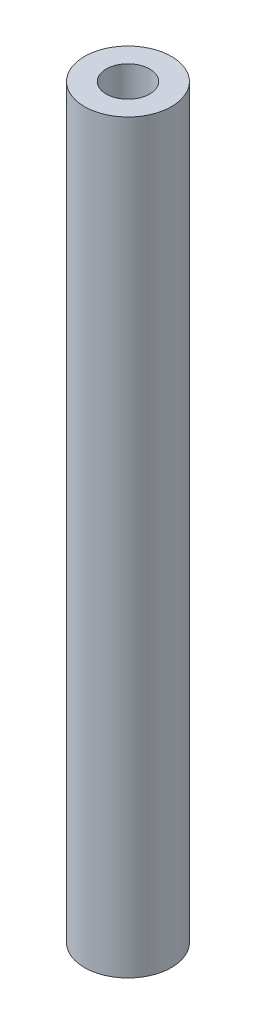
ISO-10303-21;
HEADER;
FILE_DESCRIPTION(('STEP AP214'),'2;1');
FILE_NAME('part.step','',(''),(''),'','','');
FILE_SCHEMA(('AUTOMOTIVE_DESIGN { 1 0 10303 214 1 1 1 1 }'));
ENDSEC;
DATA;
#1=APPLICATION_CONTEXT('core data for automotive mechanical design processes');
#2=APPLICATION_PROTOCOL_DEFINITION('international standard','automotive_design',2000,#1);
#3=PRODUCT_CONTEXT('',#1,'mechanical');
#4=PRODUCT('Part','Part','',(#3));
#5=PRODUCT_RELATED_PRODUCT_CATEGORY('part','',(#4));
#6=PRODUCT_DEFINITION_FORMATION('','',#4);
#7=PRODUCT_DEFINITION_CONTEXT('part definition',#1,'design');
#8=PRODUCT_DEFINITION('design','',#6,#7);
#9=PRODUCT_DEFINITION_SHAPE('','',#8);
#10=(LENGTH_UNIT() NAMED_UNIT(*) SI_UNIT(.MILLI.,.METRE.));
#11=(NAMED_UNIT(*) PLANE_ANGLE_UNIT() SI_UNIT($,.RADIAN.));
#12=(NAMED_UNIT(*) SI_UNIT($,.STERADIAN.) SOLID_ANGLE_UNIT());
#13=UNCERTAINTY_MEASURE_WITH_UNIT(LENGTH_MEASURE(1.E-05),#10,'distance_accuracy_value','');
#14=(GEOMETRIC_REPRESENTATION_CONTEXT(3) GLOBAL_UNCERTAINTY_ASSIGNED_CONTEXT((#13)) GLOBAL_UNIT_ASSIGNED_CONTEXT((#10,
#11,#12)) REPRESENTATION_CONTEXT('',''));
#15=CARTESIAN_POINT('',(0.,0.,0.));
#16=DIRECTION('',(0.,0.,1.));
#17=DIRECTION('',(1.,0.,0.));
#18=AXIS2_PLACEMENT_3D('',#15,#16,#17);
#19=CARTESIAN_POINT('',(0.,60.,0.));
#20=DIRECTION('',(0.,1.,0.));
#21=DIRECTION('',(0.,0.,1.));
#22=AXIS2_PLACEMENT_3D('',#19,#20,#21);
#23=PLANE('',#22);
#24=CARTESIAN_POINT('',(0.,60.,0.));
#25=DIRECTION('',(0.,1.,0.));
#26=DIRECTION('',(0.,0.,1.));
#27=AXIS2_PLACEMENT_3D('',#24,#25,#26);
#28=CIRCLE('',#27,3.5);
#29=CARTESIAN_POINT('',(0.,60.,3.5));
#30=VERTEX_POINT('',#29);
#31=EDGE_CURVE('E10',#30,#30,#28,.T.);
#32=ORIENTED_EDGE('',*,*,#31,.T.);
#33=EDGE_LOOP('',(#32));
#34=FACE_BOUND('',#33,.T.);
#35=CARTESIAN_POINT('',(0.,60.,0.));
#36=DIRECTION('',(0.,1.,0.));
#37=DIRECTION('',(0.,0.,1.));
#38=AXIS2_PLACEMENT_3D('',#35,#36,#37);
#39=CIRCLE('',#38,1.75);
#40=CARTESIAN_POINT('',(0.,60.,1.75));
#41=VERTEX_POINT('',#40);
#42=EDGE_CURVE('E43',#41,#41,#39,.T.);
#43=ORIENTED_EDGE('',*,*,#42,.F.);
#44=EDGE_LOOP('',(#43));
#45=FACE_BOUND('',#44,.T.);
#46=ADVANCED_FACE('F32',(#34,#45),#23,.T.);
#47=CARTESIAN_POINT('',(0.,0.,0.));
#48=DIRECTION('',(0.,1.,0.));
#49=DIRECTION('',(0.,0.,1.));
#50=AXIS2_PLACEMENT_3D('',#47,#48,#49);
#51=PLANE('',#50);
#52=CARTESIAN_POINT('',(0.,0.,0.));
#53=DIRECTION('',(0.,1.,0.));
#54=DIRECTION('',(0.,0.,1.));
#55=AXIS2_PLACEMENT_3D('',#52,#53,#54);
#56=CIRCLE('',#55,3.5);
#57=CARTESIAN_POINT('',(0.,0.,3.5));
#58=VERTEX_POINT('',#57);
#59=EDGE_CURVE('E36',#58,#58,#56,.T.);
#60=ORIENTED_EDGE('',*,*,#59,.F.);
#61=EDGE_LOOP('',(#60));
#62=FACE_BOUND('',#61,.T.);
#63=CARTESIAN_POINT('',(0.,0.,0.));
#64=DIRECTION('',(0.,1.,0.));
#65=DIRECTION('',(0.,0.,1.));
#66=AXIS2_PLACEMENT_3D('',#63,#64,#65);
#67=CIRCLE('',#66,1.75);
#68=CARTESIAN_POINT('',(0.,0.,1.75));
#69=VERTEX_POINT('',#68);
#70=EDGE_CURVE('E45',#69,#69,#67,.T.);
#71=ORIENTED_EDGE('',*,*,#70,.T.);
#72=EDGE_LOOP('',(#71));
#73=FACE_BOUND('',#72,.T.);
#74=ADVANCED_FACE('F55',(#62,#73),#51,.F.);
#75=CARTESIAN_POINT('',(0.,60.,0.));
#76=DIRECTION('',(0.,-1.,0.));
#77=DIRECTION('',(0.,0.,-1.));
#78=AXIS2_PLACEMENT_3D('',#75,#76,#77);
#79=CYLINDRICAL_SURFACE('',#78,3.5);
#80=ORIENTED_EDGE('',*,*,#31,.F.);
#81=EDGE_LOOP('',(#80));
#82=FACE_BOUND('',#81,.T.);
#83=ORIENTED_EDGE('',*,*,#59,.T.);
#84=EDGE_LOOP('',(#83));
#85=FACE_BOUND('',#84,.T.);
#86=ADVANCED_FACE('F34',(#82,#85),#79,.T.);
#87=CARTESIAN_POINT('',(0.,60.,0.));
#88=DIRECTION('',(0.,-1.,0.));
#89=DIRECTION('',(0.,0.,-1.));
#90=AXIS2_PLACEMENT_3D('',#87,#88,#89);
#91=CYLINDRICAL_SURFACE('',#90,1.75);
#92=ORIENTED_EDGE('',*,*,#42,.T.);
#93=EDGE_LOOP('',(#92));
#94=FACE_BOUND('',#93,.T.);
#95=ORIENTED_EDGE('',*,*,#70,.F.);
#96=EDGE_LOOP('',(#95));
#97=FACE_BOUND('',#96,.T.);
#98=ADVANCED_FACE('F51',(#94,#97),#91,.F.);
#99=CLOSED_SHELL('',(#46,#74,#86,#98));
#100=MANIFOLD_SOLID_BREP('B2',#99);
#101=ADVANCED_BREP_SHAPE_REPRESENTATION('',(#18,#100),#14);
#102=SHAPE_DEFINITION_REPRESENTATION(#9,#101);
ENDSEC;
END-ISO-10303-21;
